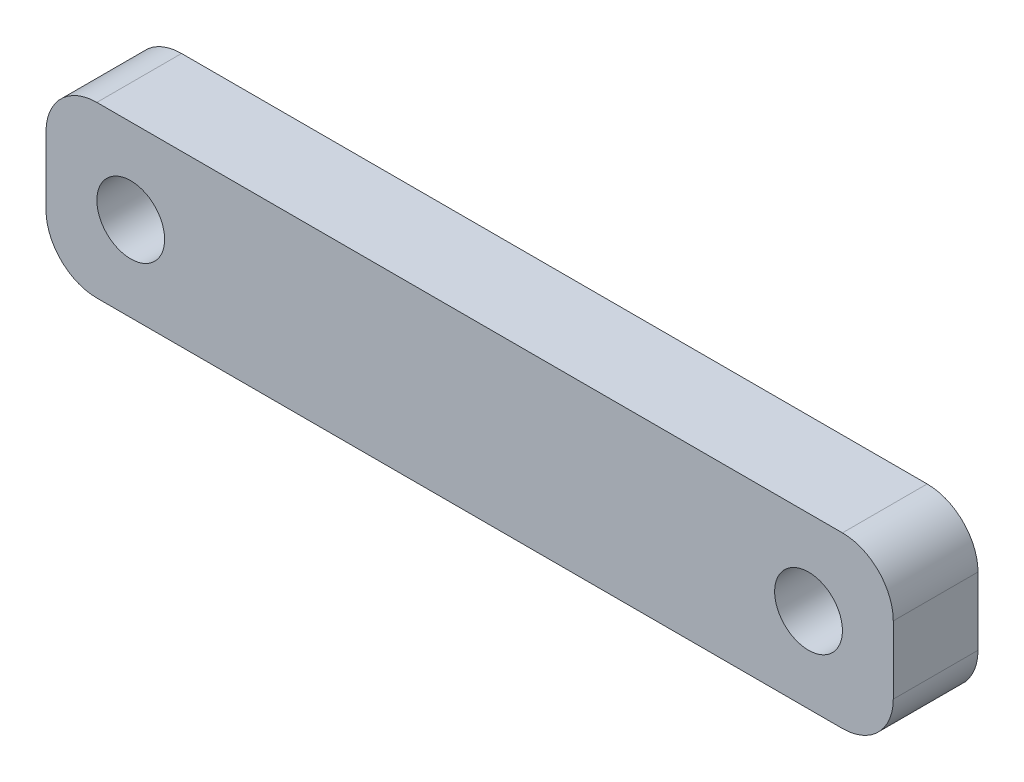
ISO-10303-21;
HEADER;
FILE_DESCRIPTION(('STEP AP214'),'2;1');
FILE_NAME('part.step','',(''),(''),'','','');
FILE_SCHEMA(('AUTOMOTIVE_DESIGN { 1 0 10303 214 1 1 1 1 }'));
ENDSEC;
DATA;
#1=APPLICATION_CONTEXT('core data for automotive mechanical design processes');
#2=APPLICATION_PROTOCOL_DEFINITION('international standard','automotive_design',2000,#1);
#3=PRODUCT_CONTEXT('',#1,'mechanical');
#4=PRODUCT('Part','Part','',(#3));
#5=PRODUCT_RELATED_PRODUCT_CATEGORY('part','',(#4));
#6=PRODUCT_DEFINITION_FORMATION('','',#4);
#7=PRODUCT_DEFINITION_CONTEXT('part definition',#1,'design');
#8=PRODUCT_DEFINITION('design','',#6,#7);
#9=PRODUCT_DEFINITION_SHAPE('','',#8);
#10=(LENGTH_UNIT() NAMED_UNIT(*) SI_UNIT(.MILLI.,.METRE.));
#11=(NAMED_UNIT(*) PLANE_ANGLE_UNIT() SI_UNIT($,.RADIAN.));
#12=(NAMED_UNIT(*) SI_UNIT($,.STERADIAN.) SOLID_ANGLE_UNIT());
#13=UNCERTAINTY_MEASURE_WITH_UNIT(LENGTH_MEASURE(1.E-05),#10,'distance_accuracy_value','');
#14=(GEOMETRIC_REPRESENTATION_CONTEXT(3) GLOBAL_UNCERTAINTY_ASSIGNED_CONTEXT((#13)) GLOBAL_UNIT_ASSIGNED_CONTEXT((#10,
#11,#12)) REPRESENTATION_CONTEXT('',''));
#15=CARTESIAN_POINT('',(0.,0.,0.));
#16=DIRECTION('',(0.,0.,1.));
#17=DIRECTION('',(1.,0.,0.));
#18=AXIS2_PLACEMENT_3D('',#15,#16,#17);
#19=CARTESIAN_POINT('',(0.,-5.,5.));
#20=DIRECTION('',(0.,1.,0.));
#21=DIRECTION('',(-1.,0.,0.));
#22=AXIS2_PLACEMENT_3D('',#19,#20,#21);
#23=PLANE('',#22);
#24=DIRECTION('',(1.,0.,0.));
#25=VECTOR('',#24,1.);
#26=CARTESIAN_POINT('',(0.,-5.,5.));
#27=LINE('',#26,#25);
#28=CARTESIAN_POINT('',(-9.5,-5.,5.));
#29=VERTEX_POINT('',#28);
#30=CARTESIAN_POINT('',(34.5,-4.99999999999999,5.));
#31=VERTEX_POINT('',#30);
#32=EDGE_CURVE('E161',#29,#31,#27,.T.);
#33=ORIENTED_EDGE('',*,*,#32,.F.);
#34=DIRECTION('',(0.,0.,-1.));
#35=VECTOR('',#34,1.);
#36=CARTESIAN_POINT('',(-9.5,-5.,5.));
#37=LINE('',#36,#35);
#38=CARTESIAN_POINT('',(-9.5,-5.,0.));
#39=VERTEX_POINT('',#38);
#40=EDGE_CURVE('E154',#29,#39,#37,.T.);
#41=ORIENTED_EDGE('',*,*,#40,.T.);
#42=DIRECTION('',(1.,0.,0.));
#43=VECTOR('',#42,1.);
#44=CARTESIAN_POINT('',(0.,-5.,0.));
#45=LINE('',#44,#43);
#46=CARTESIAN_POINT('',(34.5,-4.99999999999999,0.));
#47=VERTEX_POINT('',#46);
#48=EDGE_CURVE('E160',#39,#47,#45,.T.);
#49=ORIENTED_EDGE('',*,*,#48,.T.);
#50=DIRECTION('',(0.,0.,-1.));
#51=VECTOR('',#50,1.);
#52=CARTESIAN_POINT('',(34.5,-4.99999999999999,5.));
#53=LINE('',#52,#51);
#54=EDGE_CURVE('E141',#47,#31,#53,.F.);
#55=ORIENTED_EDGE('',*,*,#54,.T.);
#56=EDGE_LOOP('',(#33,#41,#49,#55));
#57=FACE_BOUND('',#56,.T.);
#58=ADVANCED_FACE('F34',(#57),#23,.F.);
#59=CARTESIAN_POINT('',(37.5,0.,5.));
#60=DIRECTION('',(1.,0.,0.));
#61=DIRECTION('',(0.,0.,-1.));
#62=AXIS2_PLACEMENT_3D('',#59,#60,#61);
#63=PLANE('',#62);
#64=DIRECTION('',(0.,-1.,0.));
#65=VECTOR('',#64,1.);
#66=CARTESIAN_POINT('',(37.5,0.,5.));
#67=LINE('',#66,#65);
#68=CARTESIAN_POINT('',(37.5,2.00000000000001,5.));
#69=VERTEX_POINT('',#68);
#70=CARTESIAN_POINT('',(37.5,-1.99999999999999,5.));
#71=VERTEX_POINT('',#70);
#72=EDGE_CURVE('E178',#69,#71,#67,.T.);
#73=ORIENTED_EDGE('',*,*,#72,.T.);
#74=DIRECTION('',(0.,0.,-1.));
#75=VECTOR('',#74,1.);
#76=CARTESIAN_POINT('',(37.5,-1.99999999999999,0.));
#77=LINE('',#76,#75);
#78=CARTESIAN_POINT('',(37.5,-1.99999999999999,0.));
#79=VERTEX_POINT('',#78);
#80=EDGE_CURVE('E135',#71,#79,#77,.T.);
#81=ORIENTED_EDGE('',*,*,#80,.T.);
#82=DIRECTION('',(0.,-1.,0.));
#83=VECTOR('',#82,1.);
#84=CARTESIAN_POINT('',(37.5,0.,0.));
#85=LINE('',#84,#83);
#86=CARTESIAN_POINT('',(37.5,2.00000000000001,0.));
#87=VERTEX_POINT('',#86);
#88=EDGE_CURVE('E109',#87,#79,#85,.T.);
#89=ORIENTED_EDGE('',*,*,#88,.F.);
#90=DIRECTION('',(0.,0.,-1.));
#91=VECTOR('',#90,1.);
#92=CARTESIAN_POINT('',(37.5,2.00000000000001,5.));
#93=LINE('',#92,#91);
#94=EDGE_CURVE('E117',#87,#69,#93,.F.);
#95=ORIENTED_EDGE('',*,*,#94,.T.);
#96=EDGE_LOOP('',(#73,#81,#89,#95));
#97=FACE_BOUND('',#96,.T.);
#98=ADVANCED_FACE('F197',(#97),#63,.T.);
#99=CARTESIAN_POINT('',(0.,5.,5.));
#100=DIRECTION('',(0.,1.,0.));
#101=DIRECTION('',(-1.,0.,0.));
#102=AXIS2_PLACEMENT_3D('',#99,#100,#101);
#103=PLANE('',#102);
#104=DIRECTION('',(1.,0.,0.));
#105=VECTOR('',#104,1.);
#106=CARTESIAN_POINT('',(0.,5.,0.));
#107=LINE('',#106,#105);
#108=CARTESIAN_POINT('',(-9.5,5.,0.));
#109=VERTEX_POINT('',#108);
#110=CARTESIAN_POINT('',(34.5,5.00000000000001,0.));
#111=VERTEX_POINT('',#110);
#112=EDGE_CURVE('E97',#109,#111,#107,.T.);
#113=ORIENTED_EDGE('',*,*,#112,.F.);
#114=DIRECTION('',(0.,0.,-1.));
#115=VECTOR('',#114,1.);
#116=CARTESIAN_POINT('',(-9.5,5.,5.));
#117=LINE('',#116,#115);
#118=CARTESIAN_POINT('',(-9.5,5.,5.));
#119=VERTEX_POINT('',#118);
#120=EDGE_CURVE('E150',#109,#119,#117,.F.);
#121=ORIENTED_EDGE('',*,*,#120,.T.);
#122=DIRECTION('',(1.,0.,0.));
#123=VECTOR('',#122,1.);
#124=CARTESIAN_POINT('',(0.,5.,5.));
#125=LINE('',#124,#123);
#126=CARTESIAN_POINT('',(34.5,5.00000000000001,5.));
#127=VERTEX_POINT('',#126);
#128=EDGE_CURVE('E121',#119,#127,#125,.T.);
#129=ORIENTED_EDGE('',*,*,#128,.T.);
#130=DIRECTION('',(0.,0.,-1.));
#131=VECTOR('',#130,1.);
#132=CARTESIAN_POINT('',(34.5,5.00000000000001,5.));
#133=LINE('',#132,#131);
#134=EDGE_CURVE('E116',#127,#111,#133,.T.);
#135=ORIENTED_EDGE('',*,*,#134,.T.);
#136=EDGE_LOOP('',(#113,#121,#129,#135));
#137=FACE_BOUND('',#136,.T.);
#138=ADVANCED_FACE('F119',(#137),#103,.T.);
#139=CARTESIAN_POINT('',(-12.5,0.,5.));
#140=DIRECTION('',(1.,0.,0.));
#141=DIRECTION('',(0.,0.,-1.));
#142=AXIS2_PLACEMENT_3D('',#139,#140,#141);
#143=PLANE('',#142);
#144=DIRECTION('',(0.,-1.,0.));
#145=VECTOR('',#144,1.);
#146=CARTESIAN_POINT('',(-12.5,0.,0.));
#147=LINE('',#146,#145);
#148=CARTESIAN_POINT('',(-12.5,2.,0.));
#149=VERTEX_POINT('',#148);
#150=CARTESIAN_POINT('',(-12.5,-2.,0.));
#151=VERTEX_POINT('',#150);
#152=EDGE_CURVE('E108',#149,#151,#147,.T.);
#153=ORIENTED_EDGE('',*,*,#152,.T.);
#154=DIRECTION('',(0.,0.,-1.));
#155=VECTOR('',#154,1.);
#156=CARTESIAN_POINT('',(-12.5,-2.,5.));
#157=LINE('',#156,#155);
#158=CARTESIAN_POINT('',(-12.5,-2.,5.));
#159=VERTEX_POINT('',#158);
#160=EDGE_CURVE('E42',#151,#159,#157,.F.);
#161=ORIENTED_EDGE('',*,*,#160,.T.);
#162=DIRECTION('',(0.,-1.,0.));
#163=VECTOR('',#162,1.);
#164=CARTESIAN_POINT('',(-12.5,0.,5.));
#165=LINE('',#164,#163);
#166=CARTESIAN_POINT('',(-12.5,2.,5.));
#167=VERTEX_POINT('',#166);
#168=EDGE_CURVE('E126',#167,#159,#165,.T.);
#169=ORIENTED_EDGE('',*,*,#168,.F.);
#170=DIRECTION('',(0.,0.,-1.));
#171=VECTOR('',#170,1.);
#172=CARTESIAN_POINT('',(-12.5,2.,0.));
#173=LINE('',#172,#171);
#174=EDGE_CURVE('E146',#167,#149,#173,.T.);
#175=ORIENTED_EDGE('',*,*,#174,.T.);
#176=EDGE_LOOP('',(#153,#161,#169,#175));
#177=FACE_BOUND('',#176,.T.);
#178=ADVANCED_FACE('F210',(#177),#143,.F.);
#179=CARTESIAN_POINT('',(-7.5,0.,5.));
#180=DIRECTION('',(0.,0.,-1.));
#181=DIRECTION('',(-1.,0.,0.));
#182=AXIS2_PLACEMENT_3D('',#179,#180,#181);
#183=CYLINDRICAL_SURFACE('',#182,2.);
#184=CARTESIAN_POINT('',(-7.5,0.,5.));
#185=DIRECTION('',(0.,0.,1.));
#186=DIRECTION('',(1.,0.,0.));
#187=AXIS2_PLACEMENT_3D('',#184,#185,#186);
#188=CIRCLE('',#187,2.);
#189=CARTESIAN_POINT('',(-5.5,0.,5.));
#190=VERTEX_POINT('',#189);
#191=EDGE_CURVE('E171',#190,#190,#188,.T.);
#192=ORIENTED_EDGE('',*,*,#191,.T.);
#193=EDGE_LOOP('',(#192));
#194=FACE_BOUND('',#193,.T.);
#195=CARTESIAN_POINT('',(-7.5,0.,0.));
#196=DIRECTION('',(0.,0.,1.));
#197=DIRECTION('',(1.,0.,0.));
#198=AXIS2_PLACEMENT_3D('',#195,#196,#197);
#199=CIRCLE('',#198,2.);
#200=CARTESIAN_POINT('',(-5.5,0.,0.));
#201=VERTEX_POINT('',#200);
#202=EDGE_CURVE('E165',#201,#201,#199,.T.);
#203=ORIENTED_EDGE('',*,*,#202,.F.);
#204=EDGE_LOOP('',(#203));
#205=FACE_BOUND('',#204,.T.);
#206=ADVANCED_FACE('F206',(#194,#205),#183,.F.);
#207=CARTESIAN_POINT('',(32.5,0.,5.));
#208=DIRECTION('',(0.,0.,-1.));
#209=DIRECTION('',(-1.,0.,0.));
#210=AXIS2_PLACEMENT_3D('',#207,#208,#209);
#211=CYLINDRICAL_SURFACE('',#210,2.);
#212=CARTESIAN_POINT('',(32.5,0.,5.));
#213=DIRECTION('',(0.,0.,1.));
#214=DIRECTION('',(1.,0.,0.));
#215=AXIS2_PLACEMENT_3D('',#212,#213,#214);
#216=CIRCLE('',#215,2.);
#217=CARTESIAN_POINT('',(34.5,0.,5.));
#218=VERTEX_POINT('',#217);
#219=EDGE_CURVE('E123',#218,#218,#216,.F.);
#220=ORIENTED_EDGE('',*,*,#219,.F.);
#221=EDGE_LOOP('',(#220));
#222=FACE_BOUND('',#221,.T.);
#223=CARTESIAN_POINT('',(32.5,0.,0.));
#224=DIRECTION('',(0.,0.,1.));
#225=DIRECTION('',(1.,0.,0.));
#226=AXIS2_PLACEMENT_3D('',#223,#224,#225);
#227=CIRCLE('',#226,2.);
#228=CARTESIAN_POINT('',(34.5,0.,0.));
#229=VERTEX_POINT('',#228);
#230=EDGE_CURVE('E129',#229,#229,#227,.F.);
#231=ORIENTED_EDGE('',*,*,#230,.T.);
#232=EDGE_LOOP('',(#231));
#233=FACE_BOUND('',#232,.T.);
#234=ADVANCED_FACE('F209',(#222,#233),#211,.F.);
#235=CARTESIAN_POINT('',(0.,0.,5.));
#236=DIRECTION('',(0.,0.,1.));
#237=DIRECTION('',(1.,0.,0.));
#238=AXIS2_PLACEMENT_3D('',#235,#236,#237);
#239=PLANE('',#238);
#240=ORIENTED_EDGE('',*,*,#191,.F.);
#241=EDGE_LOOP('',(#240));
#242=FACE_BOUND('',#241,.T.);
#243=ORIENTED_EDGE('',*,*,#168,.T.);
#244=CARTESIAN_POINT('',(-9.5,-2.,5.));
#245=DIRECTION('',(0.,0.,1.));
#246=DIRECTION('',(1.,0.,0.));
#247=AXIS2_PLACEMENT_3D('',#244,#245,#246);
#248=CIRCLE('',#247,3.);
#249=EDGE_CURVE('E11',#159,#29,#248,.T.);
#250=ORIENTED_EDGE('',*,*,#249,.T.);
#251=ORIENTED_EDGE('',*,*,#32,.T.);
#252=CARTESIAN_POINT('',(34.5,-1.99999999999999,5.));
#253=DIRECTION('',(0.,0.,1.));
#254=DIRECTION('',(1.,0.,0.));
#255=AXIS2_PLACEMENT_3D('',#252,#253,#254);
#256=CIRCLE('',#255,3.);
#257=EDGE_CURVE('E144',#31,#71,#256,.T.);
#258=ORIENTED_EDGE('',*,*,#257,.T.);
#259=ORIENTED_EDGE('',*,*,#72,.F.);
#260=CARTESIAN_POINT('',(34.5,2.00000000000001,5.));
#261=DIRECTION('',(0.,0.,1.));
#262=DIRECTION('',(1.,0.,0.));
#263=AXIS2_PLACEMENT_3D('',#260,#261,#262);
#264=CIRCLE('',#263,3.);
#265=EDGE_CURVE('E133',#69,#127,#264,.T.);
#266=ORIENTED_EDGE('',*,*,#265,.T.);
#267=ORIENTED_EDGE('',*,*,#128,.F.);
#268=CARTESIAN_POINT('',(-9.5,2.,5.));
#269=DIRECTION('',(0.,0.,1.));
#270=DIRECTION('',(1.,0.,0.));
#271=AXIS2_PLACEMENT_3D('',#268,#269,#270);
#272=CIRCLE('',#271,3.);
#273=EDGE_CURVE('E152',#119,#167,#272,.T.);
#274=ORIENTED_EDGE('',*,*,#273,.T.);
#275=EDGE_LOOP('',(#243,#250,#251,#258,#259,#266,#267,#274));
#276=FACE_BOUND('',#275,.T.);
#277=ORIENTED_EDGE('',*,*,#219,.T.);
#278=EDGE_LOOP('',(#277));
#279=FACE_BOUND('',#278,.T.);
#280=ADVANCED_FACE('F185',(#242,#276,#279),#239,.T.);
#281=CARTESIAN_POINT('',(0.,0.,0.));
#282=DIRECTION('',(0.,0.,1.));
#283=DIRECTION('',(1.,0.,0.));
#284=AXIS2_PLACEMENT_3D('',#281,#282,#283);
#285=PLANE('',#284);
#286=ORIENTED_EDGE('',*,*,#202,.T.);
#287=EDGE_LOOP('',(#286));
#288=FACE_BOUND('',#287,.T.);
#289=ORIENTED_EDGE('',*,*,#48,.F.);
#290=CARTESIAN_POINT('',(-9.5,-2.,0.));
#291=DIRECTION('',(0.,0.,1.));
#292=DIRECTION('',(1.,0.,0.));
#293=AXIS2_PLACEMENT_3D('',#290,#291,#292);
#294=CIRCLE('',#293,3.);
#295=EDGE_CURVE('E56',#39,#151,#294,.F.);
#296=ORIENTED_EDGE('',*,*,#295,.T.);
#297=ORIENTED_EDGE('',*,*,#152,.F.);
#298=CARTESIAN_POINT('',(-9.5,2.,0.));
#299=DIRECTION('',(0.,0.,1.));
#300=DIRECTION('',(1.,0.,0.));
#301=AXIS2_PLACEMENT_3D('',#298,#299,#300);
#302=CIRCLE('',#301,3.);
#303=EDGE_CURVE('E104',#149,#109,#302,.F.);
#304=ORIENTED_EDGE('',*,*,#303,.T.);
#305=ORIENTED_EDGE('',*,*,#112,.T.);
#306=CARTESIAN_POINT('',(34.5,2.00000000000001,0.));
#307=DIRECTION('',(0.,0.,1.));
#308=DIRECTION('',(1.,0.,0.));
#309=AXIS2_PLACEMENT_3D('',#306,#307,#308);
#310=CIRCLE('',#309,3.);
#311=EDGE_CURVE('E102',#111,#87,#310,.F.);
#312=ORIENTED_EDGE('',*,*,#311,.T.);
#313=ORIENTED_EDGE('',*,*,#88,.T.);
#314=CARTESIAN_POINT('',(34.5,-1.99999999999999,0.));
#315=DIRECTION('',(0.,0.,1.));
#316=DIRECTION('',(1.,0.,0.));
#317=AXIS2_PLACEMENT_3D('',#314,#315,#316);
#318=CIRCLE('',#317,3.);
#319=EDGE_CURVE('E138',#79,#47,#318,.F.);
#320=ORIENTED_EDGE('',*,*,#319,.T.);
#321=EDGE_LOOP('',(#289,#296,#297,#304,#305,#312,#313,#320));
#322=FACE_BOUND('',#321,.T.);
#323=ORIENTED_EDGE('',*,*,#230,.F.);
#324=EDGE_LOOP('',(#323));
#325=FACE_BOUND('',#324,.T.);
#326=ADVANCED_FACE('F99',(#288,#322,#325),#285,.F.);
#327=CARTESIAN_POINT('',(34.5,2.00000000000001,5.));
#328=DIRECTION('',(0.,0.,-1.));
#329=DIRECTION('',(-1.,0.,0.));
#330=AXIS2_PLACEMENT_3D('',#327,#328,#329);
#331=CYLINDRICAL_SURFACE('',#330,3.);
#332=ORIENTED_EDGE('',*,*,#265,.F.);
#333=ORIENTED_EDGE('',*,*,#94,.F.);
#334=ORIENTED_EDGE('',*,*,#311,.F.);
#335=ORIENTED_EDGE('',*,*,#134,.F.);
#336=EDGE_LOOP('',(#332,#333,#334,#335));
#337=FACE_BOUND('',#336,.T.);
#338=ADVANCED_FACE('F115',(#337),#331,.T.);
#339=CARTESIAN_POINT('',(34.5,-1.99999999999999,5.));
#340=DIRECTION('',(0.,0.,1.));
#341=DIRECTION('',(1.,0.,0.));
#342=AXIS2_PLACEMENT_3D('',#339,#340,#341);
#343=CYLINDRICAL_SURFACE('',#342,3.);
#344=ORIENTED_EDGE('',*,*,#257,.F.);
#345=ORIENTED_EDGE('',*,*,#54,.F.);
#346=ORIENTED_EDGE('',*,*,#319,.F.);
#347=ORIENTED_EDGE('',*,*,#80,.F.);
#348=EDGE_LOOP('',(#344,#345,#346,#347));
#349=FACE_BOUND('',#348,.T.);
#350=ADVANCED_FACE('F194',(#349),#343,.T.);
#351=CARTESIAN_POINT('',(-9.5,2.,5.));
#352=DIRECTION('',(0.,0.,1.));
#353=DIRECTION('',(1.,0.,0.));
#354=AXIS2_PLACEMENT_3D('',#351,#352,#353);
#355=CYLINDRICAL_SURFACE('',#354,3.);
#356=ORIENTED_EDGE('',*,*,#273,.F.);
#357=ORIENTED_EDGE('',*,*,#120,.F.);
#358=ORIENTED_EDGE('',*,*,#303,.F.);
#359=ORIENTED_EDGE('',*,*,#174,.F.);
#360=EDGE_LOOP('',(#356,#357,#358,#359));
#361=FACE_BOUND('',#360,.T.);
#362=ADVANCED_FACE('F190',(#361),#355,.T.);
#363=CARTESIAN_POINT('',(-9.5,-2.,5.));
#364=DIRECTION('',(0.,0.,-1.));
#365=DIRECTION('',(-1.,0.,0.));
#366=AXIS2_PLACEMENT_3D('',#363,#364,#365);
#367=CYLINDRICAL_SURFACE('',#366,3.);
#368=ORIENTED_EDGE('',*,*,#249,.F.);
#369=ORIENTED_EDGE('',*,*,#160,.F.);
#370=ORIENTED_EDGE('',*,*,#295,.F.);
#371=ORIENTED_EDGE('',*,*,#40,.F.);
#372=EDGE_LOOP('',(#368,#369,#370,#371));
#373=FACE_BOUND('',#372,.T.);
#374=ADVANCED_FACE('F36',(#373),#367,.T.);
#375=CLOSED_SHELL('',(#58,#98,#138,#178,#206,#234,#280,#326,#338,#350,#362,#374));
#376=MANIFOLD_SOLID_BREP('B2',#375);
#377=ADVANCED_BREP_SHAPE_REPRESENTATION('',(#18,#376),#14);
#378=SHAPE_DEFINITION_REPRESENTATION(#9,#377);
ENDSEC;
END-ISO-10303-21;
